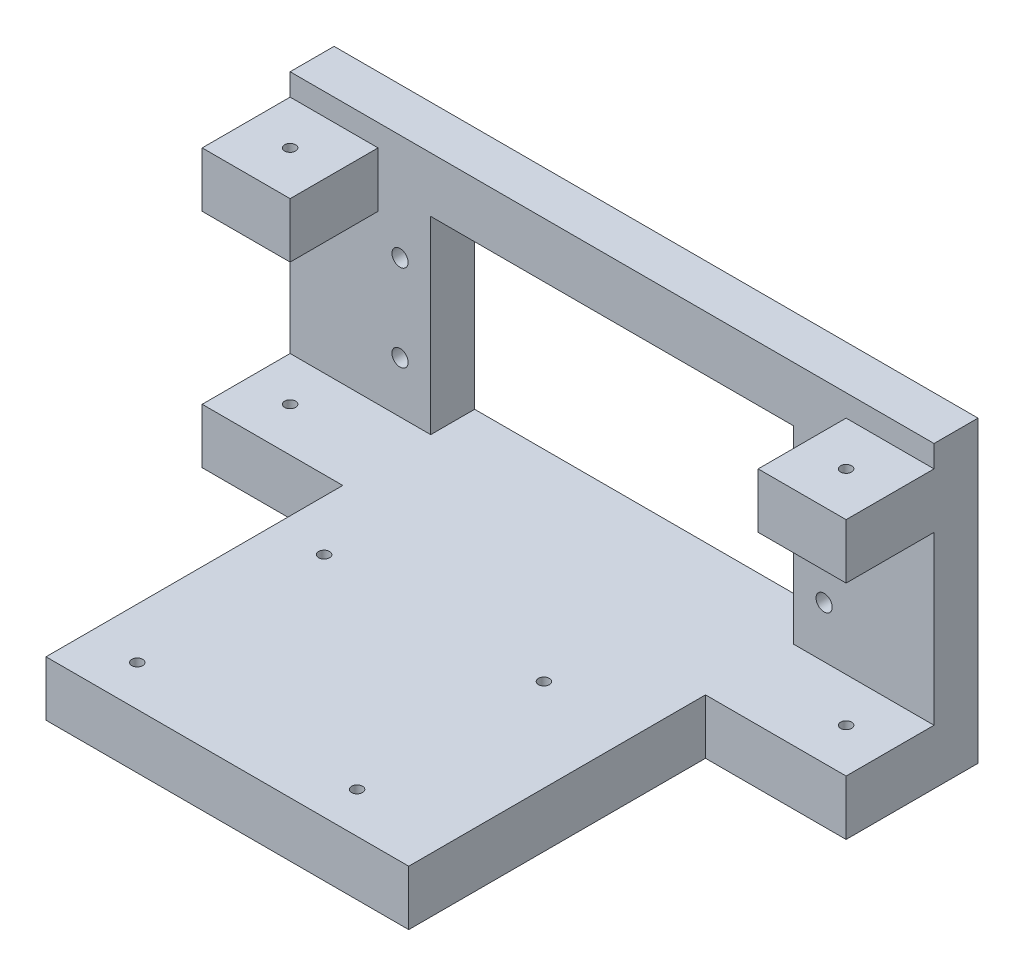
ISO-10303-21;
HEADER;
FILE_DESCRIPTION(('STEP AP214'),'2;1');
FILE_NAME('part.step','',(''),(''),'','','');
FILE_SCHEMA(('AUTOMOTIVE_DESIGN { 1 0 10303 214 1 1 1 1 }'));
ENDSEC;
DATA;
#1=APPLICATION_CONTEXT('core data for automotive mechanical design processes');
#2=APPLICATION_PROTOCOL_DEFINITION('international standard','automotive_design',2000,#1);
#3=PRODUCT_CONTEXT('',#1,'mechanical');
#4=PRODUCT('Part','Part','',(#3));
#5=PRODUCT_RELATED_PRODUCT_CATEGORY('part','',(#4));
#6=PRODUCT_DEFINITION_FORMATION('','',#4);
#7=PRODUCT_DEFINITION_CONTEXT('part definition',#1,'design');
#8=PRODUCT_DEFINITION('design','',#6,#7);
#9=PRODUCT_DEFINITION_SHAPE('','',#8);
#10=(LENGTH_UNIT() NAMED_UNIT(*) SI_UNIT(.MILLI.,.METRE.));
#11=(NAMED_UNIT(*) PLANE_ANGLE_UNIT() SI_UNIT($,.RADIAN.));
#12=(NAMED_UNIT(*) SI_UNIT($,.STERADIAN.) SOLID_ANGLE_UNIT());
#13=UNCERTAINTY_MEASURE_WITH_UNIT(LENGTH_MEASURE(1.E-05),#10,'distance_accuracy_value','');
#14=(GEOMETRIC_REPRESENTATION_CONTEXT(3) GLOBAL_UNCERTAINTY_ASSIGNED_CONTEXT((#13)) GLOBAL_UNIT_ASSIGNED_CONTEXT((#10,
#11,#12)) REPRESENTATION_CONTEXT('',''));
#15=CARTESIAN_POINT('',(0.,0.,0.));
#16=DIRECTION('',(0.,0.,1.));
#17=DIRECTION('',(1.,0.,0.));
#18=AXIS2_PLACEMENT_3D('',#15,#16,#17);
#19=CARTESIAN_POINT('',(0.,0.,5.08));
#20=DIRECTION('',(0.,0.,-1.));
#21=DIRECTION('',(-1.,0.,0.));
#22=AXIS2_PLACEMENT_3D('',#19,#20,#21);
#23=PLANE('',#22);
#24=CARTESIAN_POINT('',(2.80543,28.62199,5.08));
#25=DIRECTION('',(0.,0.,1.));
#26=DIRECTION('',(1.,0.,0.));
#27=AXIS2_PLACEMENT_3D('',#24,#25,#26);
#28=CIRCLE('',#27,0.935990000000001);
#29=CARTESIAN_POINT('',(3.74142,28.62199,5.08));
#30=VERTEX_POINT('',#29);
#31=EDGE_CURVE('E268',#30,#30,#28,.T.);
#32=ORIENTED_EDGE('',*,*,#31,.F.);
#33=EDGE_LOOP('',(#32));
#34=FACE_BOUND('',#33,.T.);
#35=CARTESIAN_POINT('',(2.80543,18.62201,5.08));
#36=DIRECTION('',(0.,0.,1.));
#37=DIRECTION('',(1.,0.,0.));
#38=AXIS2_PLACEMENT_3D('',#35,#36,#37);
#39=CIRCLE('',#38,0.935990000000001);
#40=CARTESIAN_POINT('',(3.74142,18.62201,5.08));
#41=VERTEX_POINT('',#40);
#42=EDGE_CURVE('E274',#41,#41,#39,.T.);
#43=ORIENTED_EDGE('',*,*,#42,.F.);
#44=EDGE_LOOP('',(#43));
#45=FACE_BOUND('',#44,.T.);
#46=CARTESIAN_POINT('',(51.80457,28.62199,5.08));
#47=DIRECTION('',(0.,0.,1.));
#48=DIRECTION('',(1.,0.,0.));
#49=AXIS2_PLACEMENT_3D('',#46,#47,#48);
#50=CIRCLE('',#49,0.935990000000007);
#51=CARTESIAN_POINT('',(52.74056,28.62199,5.08));
#52=VERTEX_POINT('',#51);
#53=EDGE_CURVE('E280',#52,#52,#50,.T.);
#54=ORIENTED_EDGE('',*,*,#53,.F.);
#55=EDGE_LOOP('',(#54));
#56=FACE_BOUND('',#55,.T.);
#57=CARTESIAN_POINT('',(51.80457,18.62201,5.08));
#58=DIRECTION('',(0.,0.,1.));
#59=DIRECTION('',(1.,0.,0.));
#60=AXIS2_PLACEMENT_3D('',#57,#58,#59);
#61=CIRCLE('',#60,0.935990000000007);
#62=CARTESIAN_POINT('',(52.74056,18.62201,5.08));
#63=VERTEX_POINT('',#62);
#64=EDGE_CURVE('E286',#63,#63,#61,.T.);
#65=ORIENTED_EDGE('',*,*,#64,.F.);
#66=EDGE_LOOP('',(#65));
#67=FACE_BOUND('',#66,.T.);
#68=DIRECTION('',(0.,1.,0.));
#69=VECTOR('',#68,1.);
#70=CARTESIAN_POINT('',(48.26,12.7,5.08));
#71=LINE('',#70,#69);
#72=CARTESIAN_POINT('',(48.26,12.7,5.08));
#73=VERTEX_POINT('',#72);
#74=CARTESIAN_POINT('',(48.26,34.544,5.08));
#75=VERTEX_POINT('',#74);
#76=EDGE_CURVE('E205',#73,#75,#71,.T.);
#77=ORIENTED_EDGE('',*,*,#76,.F.);
#78=DIRECTION('',(1.,0.,0.));
#79=VECTOR('',#78,1.);
#80=CARTESIAN_POINT('',(48.26,12.7,5.08));
#81=LINE('',#80,#79);
#82=CARTESIAN_POINT('',(64.50457,12.7,5.08));
#83=VERTEX_POINT('',#82);
#84=EDGE_CURVE('E191',#73,#83,#81,.T.);
#85=ORIENTED_EDGE('',*,*,#84,.T.);
#86=DIRECTION('',(0.,1.,0.));
#87=VECTOR('',#86,1.);
#88=CARTESIAN_POINT('',(64.50457,6.35,5.08));
#89=LINE('',#88,#87);
#90=CARTESIAN_POINT('',(64.50457,32.004,5.08));
#91=VERTEX_POINT('',#90);
#92=EDGE_CURVE('E201',#83,#91,#89,.T.);
#93=ORIENTED_EDGE('',*,*,#92,.T.);
#94=DIRECTION('',(1.,0.,0.));
#95=VECTOR('',#94,1.);
#96=CARTESIAN_POINT('',(54.34457,32.004,5.08));
#97=LINE('',#96,#95);
#98=CARTESIAN_POINT('',(54.34457,32.004,5.08));
#99=VERTEX_POINT('',#98);
#100=EDGE_CURVE('E355',#99,#91,#97,.T.);
#101=ORIENTED_EDGE('',*,*,#100,.F.);
#102=DIRECTION('',(0.,-1.,0.));
#103=VECTOR('',#102,1.);
#104=CARTESIAN_POINT('',(54.34457,38.354,5.08));
#105=LINE('',#104,#103);
#106=CARTESIAN_POINT('',(54.34457,38.354,5.08));
#107=VERTEX_POINT('',#106);
#108=EDGE_CURVE('E364',#107,#99,#105,.T.);
#109=ORIENTED_EDGE('',*,*,#108,.F.);
#110=DIRECTION('',(-1.,0.,0.));
#111=VECTOR('',#110,1.);
#112=CARTESIAN_POINT('',(54.34457,38.354,5.08));
#113=LINE('',#112,#111);
#114=CARTESIAN_POINT('',(64.50457,38.354,5.08));
#115=VERTEX_POINT('',#114);
#116=EDGE_CURVE('E350',#115,#107,#113,.T.);
#117=ORIENTED_EDGE('',*,*,#116,.F.);
#118=CARTESIAN_POINT('',(64.50457,40.894,5.08));
#119=VERTEX_POINT('',#118);
#120=EDGE_CURVE('E215',#115,#119,#89,.T.);
#121=ORIENTED_EDGE('',*,*,#120,.T.);
#122=DIRECTION('',(1.,0.,0.));
#123=VECTOR('',#122,1.);
#124=CARTESIAN_POINT('',(-5.842,40.894,5.08));
#125=LINE('',#124,#123);
#126=CARTESIAN_POINT('',(-9.89457,40.894,5.08));
#127=VERTEX_POINT('',#126);
#128=EDGE_CURVE('E289',#127,#119,#125,.T.);
#129=ORIENTED_EDGE('',*,*,#128,.F.);
#130=DIRECTION('',(0.,-1.,0.));
#131=VECTOR('',#130,1.);
#132=CARTESIAN_POINT('',(-9.89457,40.894,5.08));
#133=LINE('',#132,#131);
#134=CARTESIAN_POINT('',(-9.89457,38.354,5.08));
#135=VERTEX_POINT('',#134);
#136=EDGE_CURVE('E237',#127,#135,#133,.T.);
#137=ORIENTED_EDGE('',*,*,#136,.T.);
#138=DIRECTION('',(-1.,0.,0.));
#139=VECTOR('',#138,1.);
#140=CARTESIAN_POINT('',(0.265429999999997,38.354,5.08));
#141=LINE('',#140,#139);
#142=CARTESIAN_POINT('',(0.265429999999997,38.354,5.08));
#143=VERTEX_POINT('',#142);
#144=EDGE_CURVE('E391',#143,#135,#141,.T.);
#145=ORIENTED_EDGE('',*,*,#144,.F.);
#146=DIRECTION('',(0.,1.,0.));
#147=VECTOR('',#146,1.);
#148=CARTESIAN_POINT('',(0.265429999999997,38.354,5.08));
#149=LINE('',#148,#147);
#150=CARTESIAN_POINT('',(0.265429999999999,32.004,5.08));
#151=VERTEX_POINT('',#150);
#152=EDGE_CURVE('E377',#151,#143,#149,.T.);
#153=ORIENTED_EDGE('',*,*,#152,.F.);
#154=DIRECTION('',(1.,0.,0.));
#155=VECTOR('',#154,1.);
#156=CARTESIAN_POINT('',(0.265429999999999,32.004,5.08));
#157=LINE('',#156,#155);
#158=CARTESIAN_POINT('',(-9.89457,32.004,5.08));
#159=VERTEX_POINT('',#158);
#160=EDGE_CURVE('E382',#159,#151,#157,.T.);
#161=ORIENTED_EDGE('',*,*,#160,.F.);
#162=CARTESIAN_POINT('',(-9.89457,12.7,5.08));
#163=VERTEX_POINT('',#162);
#164=EDGE_CURVE('E227',#159,#163,#133,.T.);
#165=ORIENTED_EDGE('',*,*,#164,.T.);
#166=DIRECTION('',(1.,0.,0.));
#167=VECTOR('',#166,1.);
#168=CARTESIAN_POINT('',(6.35,12.7,5.08));
#169=LINE('',#168,#167);
#170=CARTESIAN_POINT('',(6.35,12.7,5.08));
#171=VERTEX_POINT('',#170);
#172=EDGE_CURVE('E324',#163,#171,#169,.T.);
#173=ORIENTED_EDGE('',*,*,#172,.T.);
#174=DIRECTION('',(0.,-1.,0.));
#175=VECTOR('',#174,1.);
#176=CARTESIAN_POINT('',(6.35,12.7,5.08));
#177=LINE('',#176,#175);
#178=CARTESIAN_POINT('',(6.35,34.544,5.08));
#179=VERTEX_POINT('',#178);
#180=EDGE_CURVE('E253',#179,#171,#177,.T.);
#181=ORIENTED_EDGE('',*,*,#180,.F.);
#182=DIRECTION('',(-1.,0.,0.));
#183=VECTOR('',#182,1.);
#184=CARTESIAN_POINT('',(6.35,34.544,5.08));
#185=LINE('',#184,#183);
#186=EDGE_CURVE('E249',#75,#179,#185,.T.);
#187=ORIENTED_EDGE('',*,*,#186,.F.);
#188=EDGE_LOOP('',(#77,#85,#93,#101,#109,#117,#121,#129,#137,#145,#153,#161,#165,#173,#181,#187));
#189=FACE_BOUND('',#188,.T.);
#190=ADVANCED_FACE('F37',(#34,#45,#56,#67,#189),#23,.F.);
#191=CARTESIAN_POINT('',(0.,0.,0.));
#192=DIRECTION('',(0.,0.,-1.));
#193=DIRECTION('',(-1.,0.,0.));
#194=AXIS2_PLACEMENT_3D('',#191,#192,#193);
#195=PLANE('',#194);
#196=DIRECTION('',(-1.,0.,0.));
#197=VECTOR('',#196,1.);
#198=CARTESIAN_POINT('',(0.,40.894,0.));
#199=LINE('',#198,#197);
#200=CARTESIAN_POINT('',(64.50457,40.894,0.));
#201=VERTEX_POINT('',#200);
#202=CARTESIAN_POINT('',(-9.89457,40.894,0.));
#203=VERTEX_POINT('',#202);
#204=EDGE_CURVE('E12',#201,#203,#199,.T.);
#205=ORIENTED_EDGE('',*,*,#204,.F.);
#206=DIRECTION('',(0.,1.,0.));
#207=VECTOR('',#206,1.);
#208=CARTESIAN_POINT('',(64.50457,6.35,0.));
#209=LINE('',#208,#207);
#210=CARTESIAN_POINT('',(64.50457,6.35,0.));
#211=VERTEX_POINT('',#210);
#212=EDGE_CURVE('E217',#211,#201,#209,.T.);
#213=ORIENTED_EDGE('',*,*,#212,.F.);
#214=DIRECTION('',(1.,0.,0.));
#215=VECTOR('',#214,1.);
#216=CARTESIAN_POINT('',(0.,6.35,0.));
#217=LINE('',#216,#215);
#218=CARTESIAN_POINT('',(-9.89457,6.35,0.));
#219=VERTEX_POINT('',#218);
#220=EDGE_CURVE('E294',#219,#211,#217,.T.);
#221=ORIENTED_EDGE('',*,*,#220,.F.);
#222=DIRECTION('',(0.,-1.,0.));
#223=VECTOR('',#222,1.);
#224=CARTESIAN_POINT('',(-9.89457,40.894,0.));
#225=LINE('',#224,#223);
#226=EDGE_CURVE('E231',#203,#219,#225,.T.);
#227=ORIENTED_EDGE('',*,*,#226,.F.);
#228=EDGE_LOOP('',(#205,#213,#221,#227));
#229=FACE_BOUND('',#228,.T.);
#230=CARTESIAN_POINT('',(51.80457,18.62201,0.));
#231=DIRECTION('',(0.,0.,1.));
#232=DIRECTION('',(1.,0.,0.));
#233=AXIS2_PLACEMENT_3D('',#230,#231,#232);
#234=CIRCLE('',#233,0.935990000000007);
#235=CARTESIAN_POINT('',(52.74056,18.62201,0.));
#236=VERTEX_POINT('',#235);
#237=EDGE_CURVE('E283',#236,#236,#234,.T.);
#238=ORIENTED_EDGE('',*,*,#237,.T.);
#239=EDGE_LOOP('',(#238));
#240=FACE_BOUND('',#239,.T.);
#241=CARTESIAN_POINT('',(51.80457,28.62199,0.));
#242=DIRECTION('',(0.,0.,1.));
#243=DIRECTION('',(1.,0.,0.));
#244=AXIS2_PLACEMENT_3D('',#241,#242,#243);
#245=CIRCLE('',#244,0.935990000000007);
#246=CARTESIAN_POINT('',(52.74056,28.62199,0.));
#247=VERTEX_POINT('',#246);
#248=EDGE_CURVE('E277',#247,#247,#245,.T.);
#249=ORIENTED_EDGE('',*,*,#248,.T.);
#250=EDGE_LOOP('',(#249));
#251=FACE_BOUND('',#250,.T.);
#252=CARTESIAN_POINT('',(2.80543,18.62201,0.));
#253=DIRECTION('',(0.,0.,1.));
#254=DIRECTION('',(1.,0.,0.));
#255=AXIS2_PLACEMENT_3D('',#252,#253,#254);
#256=CIRCLE('',#255,0.935990000000001);
#257=CARTESIAN_POINT('',(3.74142,18.62201,0.));
#258=VERTEX_POINT('',#257);
#259=EDGE_CURVE('E271',#258,#258,#256,.T.);
#260=ORIENTED_EDGE('',*,*,#259,.T.);
#261=EDGE_LOOP('',(#260));
#262=FACE_BOUND('',#261,.T.);
#263=CARTESIAN_POINT('',(2.80543,28.62199,0.));
#264=DIRECTION('',(0.,0.,1.));
#265=DIRECTION('',(1.,0.,0.));
#266=AXIS2_PLACEMENT_3D('',#263,#264,#265);
#267=CIRCLE('',#266,0.935990000000001);
#268=CARTESIAN_POINT('',(3.74142,28.62199,0.));
#269=VERTEX_POINT('',#268);
#270=EDGE_CURVE('E263',#269,#269,#267,.T.);
#271=ORIENTED_EDGE('',*,*,#270,.T.);
#272=EDGE_LOOP('',(#271));
#273=FACE_BOUND('',#272,.T.);
#274=DIRECTION('',(-1.,0.,0.));
#275=VECTOR('',#274,1.);
#276=CARTESIAN_POINT('',(6.35,34.544,0.));
#277=LINE('',#276,#275);
#278=CARTESIAN_POINT('',(48.26,34.544,0.));
#279=VERTEX_POINT('',#278);
#280=CARTESIAN_POINT('',(6.35,34.544,0.));
#281=VERTEX_POINT('',#280);
#282=EDGE_CURVE('E250',#279,#281,#277,.T.);
#283=ORIENTED_EDGE('',*,*,#282,.T.);
#284=DIRECTION('',(0.,-1.,0.));
#285=VECTOR('',#284,1.);
#286=CARTESIAN_POINT('',(6.35,12.7,0.));
#287=LINE('',#286,#285);
#288=CARTESIAN_POINT('',(6.35,12.7,0.));
#289=VERTEX_POINT('',#288);
#290=EDGE_CURVE('E260',#281,#289,#287,.T.);
#291=ORIENTED_EDGE('',*,*,#290,.T.);
#292=DIRECTION('',(1.,0.,0.));
#293=VECTOR('',#292,1.);
#294=CARTESIAN_POINT('',(6.35,12.7,0.));
#295=LINE('',#294,#293);
#296=CARTESIAN_POINT('',(48.26,12.7,0.));
#297=VERTEX_POINT('',#296);
#298=EDGE_CURVE('E257',#289,#297,#295,.T.);
#299=ORIENTED_EDGE('',*,*,#298,.T.);
#300=DIRECTION('',(0.,1.,0.));
#301=VECTOR('',#300,1.);
#302=CARTESIAN_POINT('',(48.26,12.7,0.));
#303=LINE('',#302,#301);
#304=EDGE_CURVE('E254',#297,#279,#303,.T.);
#305=ORIENTED_EDGE('',*,*,#304,.T.);
#306=EDGE_LOOP('',(#283,#291,#299,#305));
#307=FACE_BOUND('',#306,.T.);
#308=ADVANCED_FACE('F39',(#229,#240,#251,#262,#273,#307),#195,.T.);
#309=CARTESIAN_POINT('',(6.35,12.7,5.08));
#310=DIRECTION('',(1.,0.,0.));
#311=DIRECTION('',(0.,0.,-1.));
#312=AXIS2_PLACEMENT_3D('',#309,#310,#311);
#313=PLANE('',#312);
#314=ORIENTED_EDGE('',*,*,#290,.F.);
#315=DIRECTION('',(0.,0.,-1.));
#316=VECTOR('',#315,1.);
#317=CARTESIAN_POINT('',(6.35,34.544,5.08));
#318=LINE('',#317,#316);
#319=EDGE_CURVE('E246',#179,#281,#318,.T.);
#320=ORIENTED_EDGE('',*,*,#319,.F.);
#321=ORIENTED_EDGE('',*,*,#180,.T.);
#322=DIRECTION('',(0.,0.,-1.));
#323=VECTOR('',#322,1.);
#324=CARTESIAN_POINT('',(6.35,12.7,5.08));
#325=LINE('',#324,#323);
#326=EDGE_CURVE('E46',#171,#289,#325,.T.);
#327=ORIENTED_EDGE('',*,*,#326,.T.);
#328=EDGE_LOOP('',(#314,#320,#321,#327));
#329=FACE_BOUND('',#328,.T.);
#330=ADVANCED_FACE('F497',(#329),#313,.T.);
#331=CARTESIAN_POINT('',(6.35,12.7,5.08));
#332=DIRECTION('',(0.,1.,0.));
#333=DIRECTION('',(0.,0.,1.));
#334=AXIS2_PLACEMENT_3D('',#331,#332,#333);
#335=PLANE('',#334);
#336=CARTESIAN_POINT('',(12.192,12.7,23.2409999999998));
#337=DIRECTION('',(0.,1.,0.));
#338=DIRECTION('',(0.,0.,1.));
#339=AXIS2_PLACEMENT_3D('',#336,#337,#338);
#340=CIRCLE('',#339,0.635);
#341=CARTESIAN_POINT('',(12.192,12.7,23.8759999999998));
#342=VERTEX_POINT('',#341);
#343=EDGE_CURVE('E867',#342,#342,#340,.T.);
#344=ORIENTED_EDGE('',*,*,#343,.F.);
#345=EDGE_LOOP('',(#344));
#346=FACE_BOUND('',#345,.T.);
#347=CARTESIAN_POINT('',(12.1919999999999,12.7,44.8309999999998));
#348=DIRECTION('',(0.,1.,0.));
#349=DIRECTION('',(0.,0.,1.));
#350=AXIS2_PLACEMENT_3D('',#347,#348,#349);
#351=CIRCLE('',#350,0.635000000000001);
#352=CARTESIAN_POINT('',(12.1919999999999,12.7,45.4659999999998));
#353=VERTEX_POINT('',#352);
#354=EDGE_CURVE('E877',#353,#353,#351,.T.);
#355=ORIENTED_EDGE('',*,*,#354,.F.);
#356=EDGE_LOOP('',(#355));
#357=FACE_BOUND('',#356,.T.);
#358=CARTESIAN_POINT('',(37.5919999999999,12.7,44.8309999999999));
#359=DIRECTION('',(0.,1.,0.));
#360=DIRECTION('',(0.,0.,1.));
#361=AXIS2_PLACEMENT_3D('',#358,#359,#360);
#362=CIRCLE('',#361,0.634999999999996);
#363=CARTESIAN_POINT('',(37.5919999999999,12.7,45.4659999999999));
#364=VERTEX_POINT('',#363);
#365=EDGE_CURVE('E883',#364,#364,#362,.T.);
#366=ORIENTED_EDGE('',*,*,#365,.F.);
#367=EDGE_LOOP('',(#366));
#368=FACE_BOUND('',#367,.T.);
#369=CARTESIAN_POINT('',(37.592,12.7,23.2409999999999));
#370=DIRECTION('',(0.,1.,0.));
#371=DIRECTION('',(0.,0.,1.));
#372=AXIS2_PLACEMENT_3D('',#369,#370,#371);
#373=CIRCLE('',#372,0.634999999999995);
#374=CARTESIAN_POINT('',(37.592,12.7,23.8759999999999));
#375=VERTEX_POINT('',#374);
#376=EDGE_CURVE('E889',#375,#375,#373,.T.);
#377=ORIENTED_EDGE('',*,*,#376,.F.);
#378=EDGE_LOOP('',(#377));
#379=FACE_BOUND('',#378,.T.);
#380=CARTESIAN_POINT('',(59.42457,12.7,10.16));
#381=DIRECTION('',(0.,1.,0.));
#382=DIRECTION('',(0.,0.,1.));
#383=AXIS2_PLACEMENT_3D('',#380,#381,#382);
#384=CIRCLE('',#383,0.635000000000002);
#385=CARTESIAN_POINT('',(59.42457,12.7,10.795));
#386=VERTEX_POINT('',#385);
#387=EDGE_CURVE('E422',#386,#386,#384,.T.);
#388=ORIENTED_EDGE('',*,*,#387,.F.);
#389=EDGE_LOOP('',(#388));
#390=FACE_BOUND('',#389,.T.);
#391=CARTESIAN_POINT('',(-4.81456999999997,12.7,10.16));
#392=DIRECTION('',(0.,1.,0.));
#393=DIRECTION('',(0.,0.,1.));
#394=AXIS2_PLACEMENT_3D('',#391,#392,#393);
#395=CIRCLE('',#394,0.635000000000001);
#396=CARTESIAN_POINT('',(-4.81456999999997,12.7,10.795));
#397=VERTEX_POINT('',#396);
#398=EDGE_CURVE('E410',#397,#397,#395,.T.);
#399=ORIENTED_EDGE('',*,*,#398,.F.);
#400=EDGE_LOOP('',(#399));
#401=FACE_BOUND('',#400,.T.);
#402=ORIENTED_EDGE('',*,*,#298,.F.);
#403=ORIENTED_EDGE('',*,*,#326,.F.);
#404=ORIENTED_EDGE('',*,*,#172,.F.);
#405=DIRECTION('',(0.,0.,-1.));
#406=VECTOR('',#405,1.);
#407=CARTESIAN_POINT('',(-9.89457,12.7,5.08));
#408=LINE('',#407,#406);
#409=CARTESIAN_POINT('',(-9.89457,12.7,15.24));
#410=VERTEX_POINT('',#409);
#411=EDGE_CURVE('E327',#410,#163,#408,.T.);
#412=ORIENTED_EDGE('',*,*,#411,.F.);
#413=DIRECTION('',(-1.,0.,0.));
#414=VECTOR('',#413,1.);
#415=CARTESIAN_POINT('',(6.35,12.7,15.24));
#416=LINE('',#415,#414);
#417=CARTESIAN_POINT('',(6.35,12.7,15.24));
#418=VERTEX_POINT('',#417);
#419=EDGE_CURVE('E315',#418,#410,#416,.T.);
#420=ORIENTED_EDGE('',*,*,#419,.F.);
#421=DIRECTION('',(0.,0.,-1.));
#422=VECTOR('',#421,1.);
#423=CARTESIAN_POINT('',(6.35,12.7,49.53));
#424=LINE('',#423,#422);
#425=CARTESIAN_POINT('',(6.35,12.7,49.53));
#426=VERTEX_POINT('',#425);
#427=EDGE_CURVE('E341',#426,#418,#424,.T.);
#428=ORIENTED_EDGE('',*,*,#427,.F.);
#429=DIRECTION('',(-1.,0.,0.));
#430=VECTOR('',#429,1.);
#431=CARTESIAN_POINT('',(6.35,12.7,49.53));
#432=LINE('',#431,#430);
#433=CARTESIAN_POINT('',(48.26,12.7,49.53));
#434=VERTEX_POINT('',#433);
#435=EDGE_CURVE('E339',#434,#426,#432,.T.);
#436=ORIENTED_EDGE('',*,*,#435,.F.);
#437=DIRECTION('',(0.,0.,-1.));
#438=VECTOR('',#437,1.);
#439=CARTESIAN_POINT('',(48.26,12.7,49.53));
#440=LINE('',#439,#438);
#441=CARTESIAN_POINT('',(48.26,12.7,15.24));
#442=VERTEX_POINT('',#441);
#443=EDGE_CURVE('E344',#434,#442,#440,.T.);
#444=ORIENTED_EDGE('',*,*,#443,.T.);
#445=DIRECTION('',(-1.,0.,0.));
#446=VECTOR('',#445,1.);
#447=CARTESIAN_POINT('',(48.26,12.7,15.24));
#448=LINE('',#447,#446);
#449=CARTESIAN_POINT('',(64.50457,12.7,15.24));
#450=VERTEX_POINT('',#449);
#451=EDGE_CURVE('E54',#450,#442,#448,.T.);
#452=ORIENTED_EDGE('',*,*,#451,.F.);
#453=DIRECTION('',(0.,0.,1.));
#454=VECTOR('',#453,1.);
#455=CARTESIAN_POINT('',(64.50457,12.7,5.08));
#456=LINE('',#455,#454);
#457=EDGE_CURVE('E188',#83,#450,#456,.T.);
#458=ORIENTED_EDGE('',*,*,#457,.F.);
#459=ORIENTED_EDGE('',*,*,#84,.F.);
#460=DIRECTION('',(0.,0.,-1.));
#461=VECTOR('',#460,1.);
#462=CARTESIAN_POINT('',(48.26,12.7,5.08));
#463=LINE('',#462,#461);
#464=EDGE_CURVE('E242',#73,#297,#463,.T.);
#465=ORIENTED_EDGE('',*,*,#464,.T.);
#466=EDGE_LOOP('',(#402,#403,#404,#412,#420,#428,#436,#444,#452,#458,#459,#465));
#467=FACE_BOUND('',#466,.T.);
#468=ADVANCED_FACE('F190',(#346,#357,#368,#379,#390,#401,#467),#335,.T.);
#469=CARTESIAN_POINT('',(48.26,12.7,5.08));
#470=DIRECTION('',(-1.,0.,0.));
#471=DIRECTION('',(0.,0.,1.));
#472=AXIS2_PLACEMENT_3D('',#469,#470,#471);
#473=PLANE('',#472);
#474=ORIENTED_EDGE('',*,*,#304,.F.);
#475=ORIENTED_EDGE('',*,*,#464,.F.);
#476=ORIENTED_EDGE('',*,*,#76,.T.);
#477=DIRECTION('',(0.,0.,-1.));
#478=VECTOR('',#477,1.);
#479=CARTESIAN_POINT('',(48.26,34.544,5.08));
#480=LINE('',#479,#478);
#481=EDGE_CURVE('E244',#75,#279,#480,.T.);
#482=ORIENTED_EDGE('',*,*,#481,.T.);
#483=EDGE_LOOP('',(#474,#475,#476,#482));
#484=FACE_BOUND('',#483,.T.);
#485=ADVANCED_FACE('F506',(#484),#473,.T.);
#486=CARTESIAN_POINT('',(6.35,34.544,5.08));
#487=DIRECTION('',(0.,-1.,0.));
#488=DIRECTION('',(0.,0.,-1.));
#489=AXIS2_PLACEMENT_3D('',#486,#487,#488);
#490=PLANE('',#489);
#491=ORIENTED_EDGE('',*,*,#282,.F.);
#492=ORIENTED_EDGE('',*,*,#481,.F.);
#493=ORIENTED_EDGE('',*,*,#186,.T.);
#494=ORIENTED_EDGE('',*,*,#319,.T.);
#495=EDGE_LOOP('',(#491,#492,#493,#494));
#496=FACE_BOUND('',#495,.T.);
#497=ADVANCED_FACE('F510',(#496),#490,.T.);
#498=CARTESIAN_POINT('',(2.80543,28.62199,0.));
#499=DIRECTION('',(0.,0.,1.));
#500=DIRECTION('',(1.,0.,0.));
#501=AXIS2_PLACEMENT_3D('',#498,#499,#500);
#502=CYLINDRICAL_SURFACE('',#501,0.935990000000001);
#503=ORIENTED_EDGE('',*,*,#270,.F.);
#504=EDGE_LOOP('',(#503));
#505=FACE_BOUND('',#504,.T.);
#506=ORIENTED_EDGE('',*,*,#31,.T.);
#507=EDGE_LOOP('',(#506));
#508=FACE_BOUND('',#507,.T.);
#509=ADVANCED_FACE('F514',(#505,#508),#502,.F.);
#510=CARTESIAN_POINT('',(2.80543,18.62201,0.));
#511=DIRECTION('',(0.,0.,1.));
#512=DIRECTION('',(1.,0.,0.));
#513=AXIS2_PLACEMENT_3D('',#510,#511,#512);
#514=CYLINDRICAL_SURFACE('',#513,0.935990000000001);
#515=ORIENTED_EDGE('',*,*,#259,.F.);
#516=EDGE_LOOP('',(#515));
#517=FACE_BOUND('',#516,.T.);
#518=ORIENTED_EDGE('',*,*,#42,.T.);
#519=EDGE_LOOP('',(#518));
#520=FACE_BOUND('',#519,.T.);
#521=ADVANCED_FACE('F518',(#517,#520),#514,.F.);
#522=CARTESIAN_POINT('',(51.80457,28.62199,0.));
#523=DIRECTION('',(0.,0.,1.));
#524=DIRECTION('',(1.,0.,0.));
#525=AXIS2_PLACEMENT_3D('',#522,#523,#524);
#526=CYLINDRICAL_SURFACE('',#525,0.935990000000007);
#527=ORIENTED_EDGE('',*,*,#248,.F.);
#528=EDGE_LOOP('',(#527));
#529=FACE_BOUND('',#528,.T.);
#530=ORIENTED_EDGE('',*,*,#53,.T.);
#531=EDGE_LOOP('',(#530));
#532=FACE_BOUND('',#531,.T.);
#533=ADVANCED_FACE('F522',(#529,#532),#526,.F.);
#534=CARTESIAN_POINT('',(51.80457,18.62201,0.));
#535=DIRECTION('',(0.,0.,1.));
#536=DIRECTION('',(1.,0.,0.));
#537=AXIS2_PLACEMENT_3D('',#534,#535,#536);
#538=CYLINDRICAL_SURFACE('',#537,0.935990000000007);
#539=ORIENTED_EDGE('',*,*,#237,.F.);
#540=EDGE_LOOP('',(#539));
#541=FACE_BOUND('',#540,.T.);
#542=ORIENTED_EDGE('',*,*,#64,.T.);
#543=EDGE_LOOP('',(#542));
#544=FACE_BOUND('',#543,.T.);
#545=ADVANCED_FACE('F526',(#541,#544),#538,.F.);
#546=CARTESIAN_POINT('',(-5.842,40.894,-4.99999999997031E-05));
#547=DIRECTION('',(0.,-1.,0.));
#548=DIRECTION('',(0.,0.,-1.));
#549=AXIS2_PLACEMENT_3D('',#546,#547,#548);
#550=PLANE('',#549);
#551=ORIENTED_EDGE('',*,*,#128,.T.);
#552=DIRECTION('',(0.,0.,1.));
#553=VECTOR('',#552,1.);
#554=CARTESIAN_POINT('',(64.50457,40.894,-36.8034987067381));
#555=LINE('',#554,#553);
#556=EDGE_CURVE('E225',#201,#119,#555,.T.);
#557=ORIENTED_EDGE('',*,*,#556,.F.);
#558=ORIENTED_EDGE('',*,*,#204,.T.);
#559=DIRECTION('',(0.,0.,1.));
#560=VECTOR('',#559,1.);
#561=CARTESIAN_POINT('',(-9.89457,40.894,-36.8034987067381));
#562=LINE('',#561,#560);
#563=EDGE_CURVE('E238',#203,#127,#562,.T.);
#564=ORIENTED_EDGE('',*,*,#563,.T.);
#565=EDGE_LOOP('',(#551,#557,#558,#564));
#566=FACE_BOUND('',#565,.T.);
#567=ADVANCED_FACE('F467',(#566),#550,.F.);
#568=CARTESIAN_POINT('',(-4.572,6.35,-4.99999999997031E-05));
#569=DIRECTION('',(0.,1.,0.));
#570=DIRECTION('',(0.,0.,1.));
#571=AXIS2_PLACEMENT_3D('',#568,#569,#570);
#572=PLANE('',#571);
#573=CARTESIAN_POINT('',(12.192,6.35,23.2409999999998));
#574=DIRECTION('',(0.,-1.,0.));
#575=DIRECTION('',(0.,0.,-1.));
#576=AXIS2_PLACEMENT_3D('',#573,#574,#575);
#577=CIRCLE('',#576,0.635);
#578=CARTESIAN_POINT('',(12.192,6.35,22.6059999999998));
#579=VERTEX_POINT('',#578);
#580=EDGE_CURVE('E870',#579,#579,#577,.T.);
#581=ORIENTED_EDGE('',*,*,#580,.F.);
#582=EDGE_LOOP('',(#581));
#583=FACE_BOUND('',#582,.T.);
#584=CARTESIAN_POINT('',(12.1919999999999,6.35,44.8309999999998));
#585=DIRECTION('',(0.,-1.,0.));
#586=DIRECTION('',(0.,0.,-1.));
#587=AXIS2_PLACEMENT_3D('',#584,#585,#586);
#588=CIRCLE('',#587,0.635000000000001);
#589=CARTESIAN_POINT('',(12.1919999999999,6.35,44.1959999999998));
#590=VERTEX_POINT('',#589);
#591=EDGE_CURVE('E872',#590,#590,#588,.T.);
#592=ORIENTED_EDGE('',*,*,#591,.F.);
#593=EDGE_LOOP('',(#592));
#594=FACE_BOUND('',#593,.T.);
#595=CARTESIAN_POINT('',(37.5919999999999,6.35,44.8309999999999));
#596=DIRECTION('',(0.,-1.,0.));
#597=DIRECTION('',(0.,0.,-1.));
#598=AXIS2_PLACEMENT_3D('',#595,#596,#597);
#599=CIRCLE('',#598,0.634999999999996);
#600=CARTESIAN_POINT('',(37.5919999999999,6.35,44.1959999999999));
#601=VERTEX_POINT('',#600);
#602=EDGE_CURVE('E880',#601,#601,#599,.T.);
#603=ORIENTED_EDGE('',*,*,#602,.F.);
#604=EDGE_LOOP('',(#603));
#605=FACE_BOUND('',#604,.T.);
#606=CARTESIAN_POINT('',(37.592,6.35,23.2409999999999));
#607=DIRECTION('',(0.,-1.,0.));
#608=DIRECTION('',(0.,0.,-1.));
#609=AXIS2_PLACEMENT_3D('',#606,#607,#608);
#610=CIRCLE('',#609,0.634999999999995);
#611=CARTESIAN_POINT('',(37.592,6.35,22.6059999999999));
#612=VERTEX_POINT('',#611);
#613=EDGE_CURVE('E886',#612,#612,#610,.T.);
#614=ORIENTED_EDGE('',*,*,#613,.F.);
#615=EDGE_LOOP('',(#614));
#616=FACE_BOUND('',#615,.T.);
#617=CARTESIAN_POINT('',(59.42457,6.34999999999999,10.16));
#618=DIRECTION('',(0.,1.,0.));
#619=DIRECTION('',(1.,0.,0.));
#620=AXIS2_PLACEMENT_3D('',#617,#618,#619);
#621=CIRCLE('',#620,0.635000000000002);
#622=CARTESIAN_POINT('',(60.05957,6.34999999999999,10.16));
#623=VERTEX_POINT('',#622);
#624=EDGE_CURVE('E893',#623,#623,#621,.T.);
#625=ORIENTED_EDGE('',*,*,#624,.T.);
#626=EDGE_LOOP('',(#625));
#627=FACE_BOUND('',#626,.T.);
#628=CARTESIAN_POINT('',(-4.81456999999997,6.34999999999997,10.16));
#629=DIRECTION('',(0.,1.,0.));
#630=DIRECTION('',(-1.,0.,0.));
#631=AXIS2_PLACEMENT_3D('',#628,#629,#630);
#632=CIRCLE('',#631,0.635000000000001);
#633=CARTESIAN_POINT('',(-5.44956999999997,6.34999999999997,10.16));
#634=VERTEX_POINT('',#633);
#635=EDGE_CURVE('E411',#634,#634,#632,.T.);
#636=ORIENTED_EDGE('',*,*,#635,.T.);
#637=EDGE_LOOP('',(#636));
#638=FACE_BOUND('',#637,.T.);
#639=DIRECTION('',(-1.,0.,0.));
#640=VECTOR('',#639,1.);
#641=CARTESIAN_POINT('',(6.35,6.35,15.24));
#642=LINE('',#641,#640);
#643=CARTESIAN_POINT('',(6.35,6.35,15.24));
#644=VERTEX_POINT('',#643);
#645=CARTESIAN_POINT('',(-9.89457,6.35,15.24));
#646=VERTEX_POINT('',#645);
#647=EDGE_CURVE('E62',#644,#646,#642,.T.);
#648=ORIENTED_EDGE('',*,*,#647,.T.);
#649=DIRECTION('',(0.,0.,1.));
#650=VECTOR('',#649,1.);
#651=CARTESIAN_POINT('',(-9.89457,6.35,-36.8034987067381));
#652=LINE('',#651,#650);
#653=EDGE_CURVE('E296',#219,#646,#652,.T.);
#654=ORIENTED_EDGE('',*,*,#653,.F.);
#655=ORIENTED_EDGE('',*,*,#220,.T.);
#656=DIRECTION('',(0.,0.,1.));
#657=VECTOR('',#656,1.);
#658=CARTESIAN_POINT('',(64.50457,6.35,-36.8034987067381));
#659=LINE('',#658,#657);
#660=CARTESIAN_POINT('',(64.50457,6.35,15.24));
#661=VERTEX_POINT('',#660);
#662=EDGE_CURVE('E214',#211,#661,#659,.T.);
#663=ORIENTED_EDGE('',*,*,#662,.T.);
#664=DIRECTION('',(-1.,0.,0.));
#665=VECTOR('',#664,1.);
#666=CARTESIAN_POINT('',(48.26,6.35,15.24));
#667=LINE('',#666,#665);
#668=CARTESIAN_POINT('',(48.26,6.35,15.24));
#669=VERTEX_POINT('',#668);
#670=EDGE_CURVE('E206',#661,#669,#667,.T.);
#671=ORIENTED_EDGE('',*,*,#670,.T.);
#672=DIRECTION('',(0.,0.,-1.));
#673=VECTOR('',#672,1.);
#674=CARTESIAN_POINT('',(48.26,6.35,49.53));
#675=LINE('',#674,#673);
#676=CARTESIAN_POINT('',(48.26,6.35,49.53));
#677=VERTEX_POINT('',#676);
#678=EDGE_CURVE('E346',#677,#669,#675,.T.);
#679=ORIENTED_EDGE('',*,*,#678,.F.);
#680=DIRECTION('',(1.,0.,0.));
#681=VECTOR('',#680,1.);
#682=CARTESIAN_POINT('',(6.35,6.35,49.53));
#683=LINE('',#682,#681);
#684=CARTESIAN_POINT('',(6.35,6.35,49.53));
#685=VERTEX_POINT('',#684);
#686=EDGE_CURVE('E335',#685,#677,#683,.T.);
#687=ORIENTED_EDGE('',*,*,#686,.F.);
#688=DIRECTION('',(0.,0.,-1.));
#689=VECTOR('',#688,1.);
#690=CARTESIAN_POINT('',(6.35,6.35,49.53));
#691=LINE('',#690,#689);
#692=EDGE_CURVE('E314',#685,#644,#691,.T.);
#693=ORIENTED_EDGE('',*,*,#692,.T.);
#694=EDGE_LOOP('',(#648,#654,#655,#663,#671,#679,#687,#693));
#695=FACE_BOUND('',#694,.T.);
#696=ADVANCED_FACE('F311',(#583,#594,#605,#616,#627,#638,#695),#572,.F.);
#697=CARTESIAN_POINT('',(-9.89457,40.894,-36.8034987067381));
#698=DIRECTION('',(-1.,0.,0.));
#699=DIRECTION('',(0.,-1.,0.));
#700=AXIS2_PLACEMENT_3D('',#697,#698,#699);
#701=PLANE('',#700);
#702=ORIENTED_EDGE('',*,*,#563,.F.);
#703=ORIENTED_EDGE('',*,*,#226,.T.);
#704=ORIENTED_EDGE('',*,*,#653,.T.);
#705=DIRECTION('',(0.,-1.,0.));
#706=VECTOR('',#705,1.);
#707=CARTESIAN_POINT('',(-9.89457,31.8601579973887,15.24));
#708=LINE('',#707,#706);
#709=EDGE_CURVE('E319',#410,#646,#708,.T.);
#710=ORIENTED_EDGE('',*,*,#709,.F.);
#711=ORIENTED_EDGE('',*,*,#411,.T.);
#712=ORIENTED_EDGE('',*,*,#164,.F.);
#713=DIRECTION('',(0.,0.,-1.));
#714=VECTOR('',#713,1.);
#715=CARTESIAN_POINT('',(-9.89457,32.004,15.24));
#716=LINE('',#715,#714);
#717=CARTESIAN_POINT('',(-9.89457,32.004,15.24));
#718=VERTEX_POINT('',#717);
#719=EDGE_CURVE('E398',#718,#159,#716,.T.);
#720=ORIENTED_EDGE('',*,*,#719,.F.);
#721=DIRECTION('',(0.,-1.,0.));
#722=VECTOR('',#721,1.);
#723=CARTESIAN_POINT('',(-9.89457,38.354,15.24));
#724=LINE('',#723,#722);
#725=CARTESIAN_POINT('',(-9.89457,38.354,15.24));
#726=VERTEX_POINT('',#725);
#727=EDGE_CURVE('E384',#726,#718,#724,.T.);
#728=ORIENTED_EDGE('',*,*,#727,.F.);
#729=DIRECTION('',(0.,0.,-1.));
#730=VECTOR('',#729,1.);
#731=CARTESIAN_POINT('',(-9.89457,38.354,15.24));
#732=LINE('',#731,#730);
#733=EDGE_CURVE('E395',#726,#135,#732,.T.);
#734=ORIENTED_EDGE('',*,*,#733,.T.);
#735=ORIENTED_EDGE('',*,*,#136,.F.);
#736=EDGE_LOOP('',(#702,#703,#704,#710,#711,#712,#720,#728,#734,#735));
#737=FACE_BOUND('',#736,.T.);
#738=ADVANCED_FACE('F304',(#737),#701,.T.);
#739=CARTESIAN_POINT('',(64.50457,6.35,-36.8034987067381));
#740=DIRECTION('',(1.,0.,0.));
#741=DIRECTION('',(0.,0.,-1.));
#742=AXIS2_PLACEMENT_3D('',#739,#740,#741);
#743=PLANE('',#742);
#744=ORIENTED_EDGE('',*,*,#662,.F.);
#745=ORIENTED_EDGE('',*,*,#212,.T.);
#746=ORIENTED_EDGE('',*,*,#556,.T.);
#747=ORIENTED_EDGE('',*,*,#120,.F.);
#748=DIRECTION('',(0.,0.,-1.));
#749=VECTOR('',#748,1.);
#750=CARTESIAN_POINT('',(64.50457,38.354,15.24));
#751=LINE('',#750,#749);
#752=CARTESIAN_POINT('',(64.50457,38.354,15.24));
#753=VERTEX_POINT('',#752);
#754=EDGE_CURVE('E361',#753,#115,#751,.T.);
#755=ORIENTED_EDGE('',*,*,#754,.F.);
#756=DIRECTION('',(0.,1.,0.));
#757=VECTOR('',#756,1.);
#758=CARTESIAN_POINT('',(64.50457,38.354,15.24));
#759=LINE('',#758,#757);
#760=CARTESIAN_POINT('',(64.50457,32.004,15.24));
#761=VERTEX_POINT('',#760);
#762=EDGE_CURVE('E359',#761,#753,#759,.T.);
#763=ORIENTED_EDGE('',*,*,#762,.F.);
#764=DIRECTION('',(0.,0.,-1.));
#765=VECTOR('',#764,1.);
#766=CARTESIAN_POINT('',(64.50457,32.004,15.24));
#767=LINE('',#766,#765);
#768=EDGE_CURVE('E213',#761,#91,#767,.T.);
#769=ORIENTED_EDGE('',*,*,#768,.T.);
#770=ORIENTED_EDGE('',*,*,#92,.F.);
#771=ORIENTED_EDGE('',*,*,#457,.T.);
#772=DIRECTION('',(0.,-1.,0.));
#773=VECTOR('',#772,1.);
#774=CARTESIAN_POINT('',(64.50457,31.8601579973887,15.24));
#775=LINE('',#774,#773);
#776=EDGE_CURVE('E197',#450,#661,#775,.T.);
#777=ORIENTED_EDGE('',*,*,#776,.T.);
#778=EDGE_LOOP('',(#744,#745,#746,#747,#755,#763,#769,#770,#771,#777));
#779=FACE_BOUND('',#778,.T.);
#780=ADVANCED_FACE('F210',(#779),#743,.T.);
#781=CARTESIAN_POINT('',(0.265429999999997,38.354,15.24));
#782=DIRECTION('',(-1.,0.,0.));
#783=DIRECTION('',(0.,-1.,0.));
#784=AXIS2_PLACEMENT_3D('',#781,#782,#783);
#785=PLANE('',#784);
#786=ORIENTED_EDGE('',*,*,#152,.T.);
#787=DIRECTION('',(0.,0.,-1.));
#788=VECTOR('',#787,1.);
#789=CARTESIAN_POINT('',(0.265429999999997,38.354,15.24));
#790=LINE('',#789,#788);
#791=CARTESIAN_POINT('',(0.265429999999997,38.354,15.24));
#792=VERTEX_POINT('',#791);
#793=EDGE_CURVE('E219',#792,#143,#790,.T.);
#794=ORIENTED_EDGE('',*,*,#793,.F.);
#795=DIRECTION('',(0.,1.,0.));
#796=VECTOR('',#795,1.);
#797=CARTESIAN_POINT('',(0.265429999999997,38.354,15.24));
#798=LINE('',#797,#796);
#799=CARTESIAN_POINT('',(0.265429999999999,32.004,15.24));
#800=VERTEX_POINT('',#799);
#801=EDGE_CURVE('E378',#800,#792,#798,.T.);
#802=ORIENTED_EDGE('',*,*,#801,.F.);
#803=DIRECTION('',(0.,0.,-1.));
#804=VECTOR('',#803,1.);
#805=CARTESIAN_POINT('',(0.265429999999999,32.004,15.24));
#806=LINE('',#805,#804);
#807=EDGE_CURVE('E388',#800,#151,#806,.T.);
#808=ORIENTED_EDGE('',*,*,#807,.T.);
#809=EDGE_LOOP('',(#786,#794,#802,#808));
#810=FACE_BOUND('',#809,.T.);
#811=ADVANCED_FACE('F456',(#810),#785,.F.);
#812=CARTESIAN_POINT('',(0.265429999999997,38.354,15.24));
#813=DIRECTION('',(0.,-1.,0.));
#814=DIRECTION('',(0.,0.,-1.));
#815=AXIS2_PLACEMENT_3D('',#812,#813,#814);
#816=PLANE('',#815);
#817=CARTESIAN_POINT('',(-4.81456999999998,38.354,10.16));
#818=DIRECTION('',(0.,1.,0.));
#819=DIRECTION('',(-1.,0.,0.));
#820=AXIS2_PLACEMENT_3D('',#817,#818,#819);
#821=CIRCLE('',#820,0.635000000000001);
#822=CARTESIAN_POINT('',(-5.44956999999998,38.354,10.16));
#823=VERTEX_POINT('',#822);
#824=EDGE_CURVE('E417',#823,#823,#821,.T.);
#825=ORIENTED_EDGE('',*,*,#824,.F.);
#826=EDGE_LOOP('',(#825));
#827=FACE_BOUND('',#826,.T.);
#828=ORIENTED_EDGE('',*,*,#144,.T.);
#829=ORIENTED_EDGE('',*,*,#733,.F.);
#830=DIRECTION('',(-1.,0.,0.));
#831=VECTOR('',#830,1.);
#832=CARTESIAN_POINT('',(0.265429999999997,38.354,15.24));
#833=LINE('',#832,#831);
#834=EDGE_CURVE('E381',#792,#726,#833,.T.);
#835=ORIENTED_EDGE('',*,*,#834,.F.);
#836=ORIENTED_EDGE('',*,*,#793,.T.);
#837=EDGE_LOOP('',(#828,#829,#835,#836));
#838=FACE_BOUND('',#837,.T.);
#839=ADVANCED_FACE('F464',(#827,#838),#816,.F.);
#840=CARTESIAN_POINT('',(0.265429999999999,32.004,15.24));
#841=DIRECTION('',(0.,1.,0.));
#842=DIRECTION('',(0.,0.,1.));
#843=AXIS2_PLACEMENT_3D('',#840,#841,#842);
#844=PLANE('',#843);
#845=CARTESIAN_POINT('',(-4.81456999999998,32.004,10.16));
#846=DIRECTION('',(0.,1.,0.));
#847=DIRECTION('',(0.,0.,1.));
#848=AXIS2_PLACEMENT_3D('',#845,#846,#847);
#849=CIRCLE('',#848,0.635000000000001);
#850=CARTESIAN_POINT('',(-4.81456999999998,32.004,10.795));
#851=VERTEX_POINT('',#850);
#852=EDGE_CURVE('E408',#851,#851,#849,.T.);
#853=ORIENTED_EDGE('',*,*,#852,.T.);
#854=EDGE_LOOP('',(#853));
#855=FACE_BOUND('',#854,.T.);
#856=ORIENTED_EDGE('',*,*,#160,.T.);
#857=ORIENTED_EDGE('',*,*,#807,.F.);
#858=DIRECTION('',(1.,0.,0.));
#859=VECTOR('',#858,1.);
#860=CARTESIAN_POINT('',(0.265429999999999,32.004,15.24));
#861=LINE('',#860,#859);
#862=EDGE_CURVE('E386',#718,#800,#861,.T.);
#863=ORIENTED_EDGE('',*,*,#862,.F.);
#864=ORIENTED_EDGE('',*,*,#719,.T.);
#865=EDGE_LOOP('',(#856,#857,#863,#864));
#866=FACE_BOUND('',#865,.T.);
#867=ADVANCED_FACE('F452',(#855,#866),#844,.F.);
#868=CARTESIAN_POINT('',(0.,0.,15.24));
#869=DIRECTION('',(0.,0.,-1.));
#870=DIRECTION('',(-1.,0.,0.));
#871=AXIS2_PLACEMENT_3D('',#868,#869,#870);
#872=PLANE('',#871);
#873=ORIENTED_EDGE('',*,*,#801,.T.);
#874=ORIENTED_EDGE('',*,*,#834,.T.);
#875=ORIENTED_EDGE('',*,*,#727,.T.);
#876=ORIENTED_EDGE('',*,*,#862,.T.);
#877=EDGE_LOOP('',(#873,#874,#875,#876));
#878=FACE_BOUND('',#877,.T.);
#879=ADVANCED_FACE('F460',(#878),#872,.F.);
#880=CARTESIAN_POINT('',(54.34457,38.354,15.24));
#881=DIRECTION('',(0.,-1.,0.));
#882=DIRECTION('',(0.,0.,-1.));
#883=AXIS2_PLACEMENT_3D('',#880,#881,#882);
#884=PLANE('',#883);
#885=CARTESIAN_POINT('',(59.42457,38.354,10.16));
#886=DIRECTION('',(0.,1.,0.));
#887=DIRECTION('',(1.,0.,0.));
#888=AXIS2_PLACEMENT_3D('',#885,#886,#887);
#889=CIRCLE('',#888,0.635000000000002);
#890=CARTESIAN_POINT('',(60.05957,38.354,10.16));
#891=VERTEX_POINT('',#890);
#892=EDGE_CURVE('E892',#891,#891,#889,.T.);
#893=ORIENTED_EDGE('',*,*,#892,.F.);
#894=EDGE_LOOP('',(#893));
#895=FACE_BOUND('',#894,.T.);
#896=ORIENTED_EDGE('',*,*,#116,.T.);
#897=DIRECTION('',(0.,0.,-1.));
#898=VECTOR('',#897,1.);
#899=CARTESIAN_POINT('',(54.34457,38.354,15.24));
#900=LINE('',#899,#898);
#901=CARTESIAN_POINT('',(54.34457,38.354,15.24));
#902=VERTEX_POINT('',#901);
#903=EDGE_CURVE('E374',#902,#107,#900,.T.);
#904=ORIENTED_EDGE('',*,*,#903,.F.);
#905=DIRECTION('',(-1.,0.,0.));
#906=VECTOR('',#905,1.);
#907=CARTESIAN_POINT('',(54.34457,38.354,15.24));
#908=LINE('',#907,#906);
#909=EDGE_CURVE('E351',#753,#902,#908,.T.);
#910=ORIENTED_EDGE('',*,*,#909,.F.);
#911=ORIENTED_EDGE('',*,*,#754,.T.);
#912=EDGE_LOOP('',(#896,#904,#910,#911));
#913=FACE_BOUND('',#912,.T.);
#914=ADVANCED_FACE('F472',(#895,#913),#884,.F.);
#915=CARTESIAN_POINT('',(54.34457,38.354,15.24));
#916=DIRECTION('',(1.,0.,0.));
#917=DIRECTION('',(0.,1.,0.));
#918=AXIS2_PLACEMENT_3D('',#915,#916,#917);
#919=PLANE('',#918);
#920=ORIENTED_EDGE('',*,*,#108,.T.);
#921=DIRECTION('',(0.,0.,-1.));
#922=VECTOR('',#921,1.);
#923=CARTESIAN_POINT('',(54.34457,32.004,15.24));
#924=LINE('',#923,#922);
#925=CARTESIAN_POINT('',(54.34457,32.004,15.24));
#926=VERTEX_POINT('',#925);
#927=EDGE_CURVE('E371',#926,#99,#924,.T.);
#928=ORIENTED_EDGE('',*,*,#927,.F.);
#929=DIRECTION('',(0.,-1.,0.));
#930=VECTOR('',#929,1.);
#931=CARTESIAN_POINT('',(54.34457,38.354,15.24));
#932=LINE('',#931,#930);
#933=EDGE_CURVE('E354',#902,#926,#932,.T.);
#934=ORIENTED_EDGE('',*,*,#933,.F.);
#935=ORIENTED_EDGE('',*,*,#903,.T.);
#936=EDGE_LOOP('',(#920,#928,#934,#935));
#937=FACE_BOUND('',#936,.T.);
#938=ADVANCED_FACE('F480',(#937),#919,.F.);
#939=CARTESIAN_POINT('',(54.34457,32.004,15.24));
#940=DIRECTION('',(0.,1.,0.));
#941=DIRECTION('',(0.,0.,1.));
#942=AXIS2_PLACEMENT_3D('',#939,#940,#941);
#943=PLANE('',#942);
#944=CARTESIAN_POINT('',(59.42457,32.004,10.16));
#945=DIRECTION('',(0.,1.,0.));
#946=DIRECTION('',(0.,0.,1.));
#947=AXIS2_PLACEMENT_3D('',#944,#945,#946);
#948=CIRCLE('',#947,0.635000000000002);
#949=CARTESIAN_POINT('',(59.42457,32.004,10.795));
#950=VERTEX_POINT('',#949);
#951=EDGE_CURVE('E41',#950,#950,#948,.T.);
#952=ORIENTED_EDGE('',*,*,#951,.T.);
#953=EDGE_LOOP('',(#952));
#954=FACE_BOUND('',#953,.T.);
#955=ORIENTED_EDGE('',*,*,#100,.T.);
#956=ORIENTED_EDGE('',*,*,#768,.F.);
#957=DIRECTION('',(1.,0.,0.));
#958=VECTOR('',#957,1.);
#959=CARTESIAN_POINT('',(54.34457,32.004,15.24));
#960=LINE('',#959,#958);
#961=EDGE_CURVE('E357',#926,#761,#960,.T.);
#962=ORIENTED_EDGE('',*,*,#961,.F.);
#963=ORIENTED_EDGE('',*,*,#927,.T.);
#964=EDGE_LOOP('',(#955,#956,#962,#963));
#965=FACE_BOUND('',#964,.T.);
#966=ADVANCED_FACE('F478',(#954,#965),#943,.F.);
#967=CARTESIAN_POINT('',(0.,0.,15.24));
#968=DIRECTION('',(0.,0.,-1.));
#969=DIRECTION('',(-1.,0.,0.));
#970=AXIS2_PLACEMENT_3D('',#967,#968,#969);
#971=PLANE('',#970);
#972=ORIENTED_EDGE('',*,*,#909,.T.);
#973=ORIENTED_EDGE('',*,*,#933,.T.);
#974=ORIENTED_EDGE('',*,*,#961,.T.);
#975=ORIENTED_EDGE('',*,*,#762,.T.);
#976=EDGE_LOOP('',(#972,#973,#974,#975));
#977=FACE_BOUND('',#976,.T.);
#978=ADVANCED_FACE('F474',(#977),#971,.F.);
#979=CARTESIAN_POINT('',(6.35,12.7,49.53));
#980=DIRECTION('',(1.,0.,0.));
#981=DIRECTION('',(0.,1.,0.));
#982=AXIS2_PLACEMENT_3D('',#979,#980,#981);
#983=PLANE('',#982);
#984=ORIENTED_EDGE('',*,*,#427,.T.);
#985=DIRECTION('',(0.,-1.,0.));
#986=VECTOR('',#985,1.);
#987=CARTESIAN_POINT('',(6.35,31.8601579973887,15.24));
#988=LINE('',#987,#986);
#989=EDGE_CURVE('E326',#418,#644,#988,.T.);
#990=ORIENTED_EDGE('',*,*,#989,.T.);
#991=ORIENTED_EDGE('',*,*,#692,.F.);
#992=DIRECTION('',(0.,-1.,0.));
#993=VECTOR('',#992,1.);
#994=CARTESIAN_POINT('',(6.35,12.7,49.53));
#995=LINE('',#994,#993);
#996=EDGE_CURVE('E332',#426,#685,#995,.T.);
#997=ORIENTED_EDGE('',*,*,#996,.F.);
#998=EDGE_LOOP('',(#984,#990,#991,#997));
#999=FACE_BOUND('',#998,.T.);
#1000=ADVANCED_FACE('F442',(#999),#983,.F.);
#1001=CARTESIAN_POINT('',(48.26,12.7,49.53));
#1002=DIRECTION('',(-1.,0.,0.));
#1003=DIRECTION('',(0.,0.,1.));
#1004=AXIS2_PLACEMENT_3D('',#1001,#1002,#1003);
#1005=PLANE('',#1004);
#1006=ORIENTED_EDGE('',*,*,#678,.T.);
#1007=DIRECTION('',(0.,-1.,0.));
#1008=VECTOR('',#1007,1.);
#1009=CARTESIAN_POINT('',(48.26,31.8601579973887,15.24));
#1010=LINE('',#1009,#1008);
#1011=EDGE_CURVE('E316',#442,#669,#1010,.T.);
#1012=ORIENTED_EDGE('',*,*,#1011,.F.);
#1013=ORIENTED_EDGE('',*,*,#443,.F.);
#1014=DIRECTION('',(0.,1.,0.));
#1015=VECTOR('',#1014,1.);
#1016=CARTESIAN_POINT('',(48.26,12.7,49.53));
#1017=LINE('',#1016,#1015);
#1018=EDGE_CURVE('E337',#677,#434,#1017,.T.);
#1019=ORIENTED_EDGE('',*,*,#1018,.F.);
#1020=EDGE_LOOP('',(#1006,#1012,#1013,#1019));
#1021=FACE_BOUND('',#1020,.T.);
#1022=ADVANCED_FACE('F434',(#1021),#1005,.F.);
#1023=CARTESIAN_POINT('',(0.,0.,49.53));
#1024=DIRECTION('',(0.,0.,1.));
#1025=DIRECTION('',(1.,0.,0.));
#1026=AXIS2_PLACEMENT_3D('',#1023,#1024,#1025);
#1027=PLANE('',#1026);
#1028=ORIENTED_EDGE('',*,*,#996,.T.);
#1029=ORIENTED_EDGE('',*,*,#686,.T.);
#1030=ORIENTED_EDGE('',*,*,#1018,.T.);
#1031=ORIENTED_EDGE('',*,*,#435,.T.);
#1032=EDGE_LOOP('',(#1028,#1029,#1030,#1031));
#1033=FACE_BOUND('',#1032,.T.);
#1034=ADVANCED_FACE('F438',(#1033),#1027,.T.);
#1035=CARTESIAN_POINT('',(6.35,31.8601579973887,15.24));
#1036=DIRECTION('',(0.,0.,1.));
#1037=DIRECTION('',(1.,0.,0.));
#1038=AXIS2_PLACEMENT_3D('',#1035,#1036,#1037);
#1039=PLANE('',#1038);
#1040=ORIENTED_EDGE('',*,*,#989,.F.);
#1041=ORIENTED_EDGE('',*,*,#419,.T.);
#1042=ORIENTED_EDGE('',*,*,#709,.T.);
#1043=ORIENTED_EDGE('',*,*,#647,.F.);
#1044=EDGE_LOOP('',(#1040,#1041,#1042,#1043));
#1045=FACE_BOUND('',#1044,.T.);
#1046=ADVANCED_FACE('F443',(#1045),#1039,.T.);
#1047=CARTESIAN_POINT('',(48.26,31.8601579973887,15.24));
#1048=DIRECTION('',(0.,0.,1.));
#1049=DIRECTION('',(1.,0.,0.));
#1050=AXIS2_PLACEMENT_3D('',#1047,#1048,#1049);
#1051=PLANE('',#1050);
#1052=ORIENTED_EDGE('',*,*,#776,.F.);
#1053=ORIENTED_EDGE('',*,*,#451,.T.);
#1054=ORIENTED_EDGE('',*,*,#1011,.T.);
#1055=ORIENTED_EDGE('',*,*,#670,.F.);
#1056=EDGE_LOOP('',(#1052,#1053,#1054,#1055));
#1057=FACE_BOUND('',#1056,.T.);
#1058=ADVANCED_FACE('F430',(#1057),#1051,.T.);
#1059=CARTESIAN_POINT('',(-4.81456999999997,6.34999999999997,10.16));
#1060=DIRECTION('',(0.,1.,0.));
#1061=DIRECTION('',(-1.,0.,0.));
#1062=AXIS2_PLACEMENT_3D('',#1059,#1060,#1061);
#1063=CYLINDRICAL_SURFACE('',#1062,0.635000000000001);
#1064=ORIENTED_EDGE('',*,*,#824,.T.);
#1065=EDGE_LOOP('',(#1064));
#1066=FACE_BOUND('',#1065,.T.);
#1067=ORIENTED_EDGE('',*,*,#852,.F.);
#1068=EDGE_LOOP('',(#1067));
#1069=FACE_BOUND('',#1068,.T.);
#1070=ADVANCED_FACE('F573',(#1066,#1069),#1063,.F.);
#1071=ORIENTED_EDGE('',*,*,#398,.T.);
#1072=EDGE_LOOP('',(#1071));
#1073=FACE_BOUND('',#1072,.T.);
#1074=ORIENTED_EDGE('',*,*,#635,.F.);
#1075=EDGE_LOOP('',(#1074));
#1076=FACE_BOUND('',#1075,.T.);
#1077=ADVANCED_FACE('F578',(#1073,#1076),#1063,.F.);
#1078=CARTESIAN_POINT('',(59.42457,6.34999999999999,10.16));
#1079=DIRECTION('',(0.,1.,0.));
#1080=DIRECTION('',(-1.,0.,0.));
#1081=AXIS2_PLACEMENT_3D('',#1078,#1079,#1080);
#1082=CYLINDRICAL_SURFACE('',#1081,0.635000000000002);
#1083=ORIENTED_EDGE('',*,*,#892,.T.);
#1084=EDGE_LOOP('',(#1083));
#1085=FACE_BOUND('',#1084,.T.);
#1086=ORIENTED_EDGE('',*,*,#951,.F.);
#1087=EDGE_LOOP('',(#1086));
#1088=FACE_BOUND('',#1087,.T.);
#1089=ADVANCED_FACE('F590',(#1085,#1088),#1082,.F.);
#1090=ORIENTED_EDGE('',*,*,#387,.T.);
#1091=EDGE_LOOP('',(#1090));
#1092=FACE_BOUND('',#1091,.T.);
#1093=ORIENTED_EDGE('',*,*,#624,.F.);
#1094=EDGE_LOOP('',(#1093));
#1095=FACE_BOUND('',#1094,.T.);
#1096=ADVANCED_FACE('F599',(#1092,#1095),#1082,.F.);
#1097=CARTESIAN_POINT('',(37.592,40.894025,23.2409999999999));
#1098=DIRECTION('',(0.,-1.,0.));
#1099=DIRECTION('',(0.,0.,-1.));
#1100=AXIS2_PLACEMENT_3D('',#1097,#1098,#1099);
#1101=CYLINDRICAL_SURFACE('',#1100,0.634999999999995);
#1102=ORIENTED_EDGE('',*,*,#376,.T.);
#1103=EDGE_LOOP('',(#1102));
#1104=FACE_BOUND('',#1103,.T.);
#1105=ORIENTED_EDGE('',*,*,#613,.T.);
#1106=EDGE_LOOP('',(#1105));
#1107=FACE_BOUND('',#1106,.T.);
#1108=ADVANCED_FACE('F608',(#1104,#1107),#1101,.F.);
#1109=CARTESIAN_POINT('',(37.5919999999999,40.894025,44.8309999999999));
#1110=DIRECTION('',(0.,-1.,0.));
#1111=DIRECTION('',(0.,0.,-1.));
#1112=AXIS2_PLACEMENT_3D('',#1109,#1110,#1111);
#1113=CYLINDRICAL_SURFACE('',#1112,0.634999999999996);
#1114=ORIENTED_EDGE('',*,*,#365,.T.);
#1115=EDGE_LOOP('',(#1114));
#1116=FACE_BOUND('',#1115,.T.);
#1117=ORIENTED_EDGE('',*,*,#602,.T.);
#1118=EDGE_LOOP('',(#1117));
#1119=FACE_BOUND('',#1118,.T.);
#1120=ADVANCED_FACE('F626',(#1116,#1119),#1113,.F.);
#1121=CARTESIAN_POINT('',(12.1919999999999,40.894025,44.8309999999998));
#1122=DIRECTION('',(0.,-1.,0.));
#1123=DIRECTION('',(0.,0.,-1.));
#1124=AXIS2_PLACEMENT_3D('',#1121,#1122,#1123);
#1125=CYLINDRICAL_SURFACE('',#1124,0.635000000000001);
#1126=ORIENTED_EDGE('',*,*,#354,.T.);
#1127=EDGE_LOOP('',(#1126));
#1128=FACE_BOUND('',#1127,.T.);
#1129=ORIENTED_EDGE('',*,*,#591,.T.);
#1130=EDGE_LOOP('',(#1129));
#1131=FACE_BOUND('',#1130,.T.);
#1132=ADVANCED_FACE('F636',(#1128,#1131),#1125,.F.);
#1133=CARTESIAN_POINT('',(12.192,40.894025,23.2409999999998));
#1134=DIRECTION('',(0.,-1.,0.));
#1135=DIRECTION('',(0.,0.,-1.));
#1136=AXIS2_PLACEMENT_3D('',#1133,#1134,#1135);
#1137=CYLINDRICAL_SURFACE('',#1136,0.635);
#1138=ORIENTED_EDGE('',*,*,#343,.T.);
#1139=EDGE_LOOP('',(#1138));
#1140=FACE_BOUND('',#1139,.T.);
#1141=ORIENTED_EDGE('',*,*,#580,.T.);
#1142=EDGE_LOOP('',(#1141));
#1143=FACE_BOUND('',#1142,.T.);
#1144=ADVANCED_FACE('F646',(#1140,#1143),#1137,.F.);
#1145=CLOSED_SHELL('',(#190,#308,#330,#468,#485,#497,#509,#521,#533,#545,#567,#696,#738,#780,
#811,#839,#867,#879,#914,#938,#966,#978,#1000,#1022,#1034,#1046,#1058,#1070,#1077,#1089,#1096,
#1108,#1120,#1132,#1144));
#1146=MANIFOLD_SOLID_BREP('B2',#1145);
#1147=ADVANCED_BREP_SHAPE_REPRESENTATION('',(#18,#1146),#14);
#1148=SHAPE_DEFINITION_REPRESENTATION(#9,#1147);
ENDSEC;
END-ISO-10303-21;
